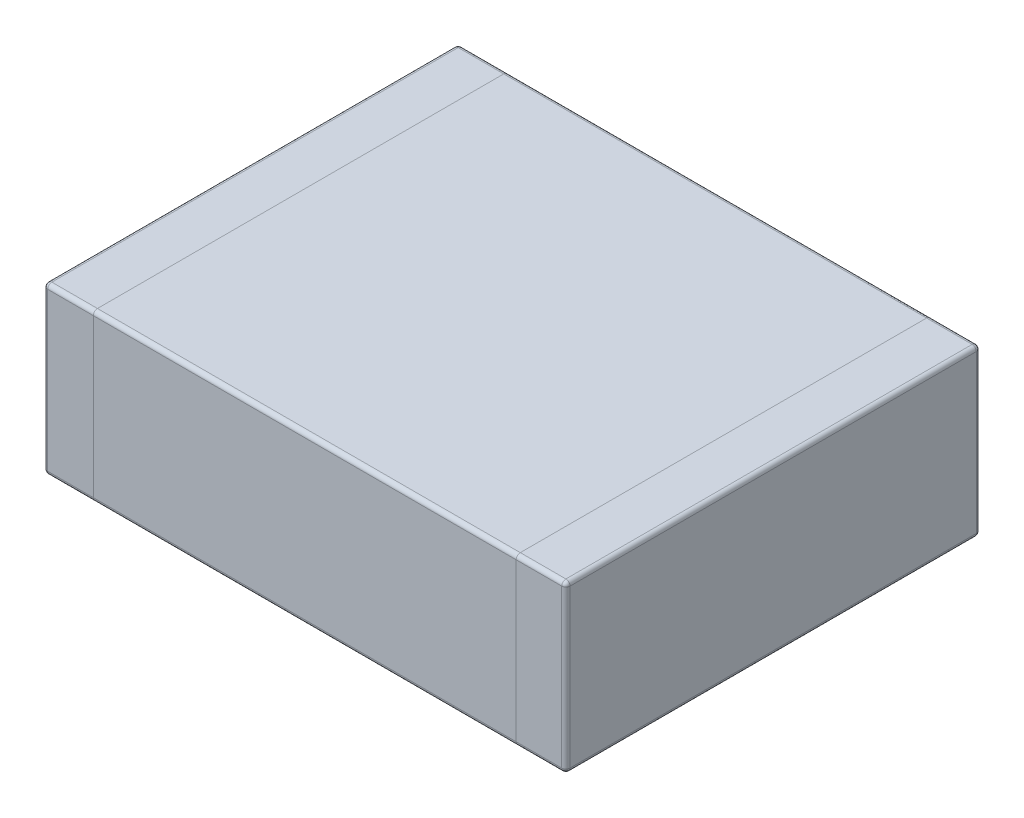
ISO-10303-21;
HEADER;
FILE_DESCRIPTION(('STEP AP214'),'2;1');
FILE_NAME('part.step','',(''),(''),'','','');
FILE_SCHEMA(('AUTOMOTIVE_DESIGN { 1 0 10303 214 1 1 1 1 }'));
ENDSEC;
DATA;
#1=APPLICATION_CONTEXT('core data for automotive mechanical design processes');
#2=APPLICATION_PROTOCOL_DEFINITION('international standard','automotive_design',2000,#1);
#3=PRODUCT_CONTEXT('',#1,'mechanical');
#4=PRODUCT('Part','Part','',(#3));
#5=PRODUCT_RELATED_PRODUCT_CATEGORY('part','',(#4));
#6=PRODUCT_DEFINITION_FORMATION('','',#4);
#7=PRODUCT_DEFINITION_CONTEXT('part definition',#1,'design');
#8=PRODUCT_DEFINITION('design','',#6,#7);
#9=PRODUCT_DEFINITION_SHAPE('','',#8);
#10=(LENGTH_UNIT() NAMED_UNIT(*) SI_UNIT(.MILLI.,.METRE.));
#11=(NAMED_UNIT(*) PLANE_ANGLE_UNIT() SI_UNIT($,.RADIAN.));
#12=(NAMED_UNIT(*) SI_UNIT($,.STERADIAN.) SOLID_ANGLE_UNIT());
#13=UNCERTAINTY_MEASURE_WITH_UNIT(LENGTH_MEASURE(1.E-05),#10,'distance_accuracy_value','');
#14=(GEOMETRIC_REPRESENTATION_CONTEXT(3) GLOBAL_UNCERTAINTY_ASSIGNED_CONTEXT((#13)) GLOBAL_UNIT_ASSIGNED_CONTEXT((#10,
#11,#12)) REPRESENTATION_CONTEXT('',''));
#15=CARTESIAN_POINT('',(0.,0.,0.));
#16=DIRECTION('',(0.,0.,1.));
#17=DIRECTION('',(1.,0.,0.));
#18=AXIS2_PLACEMENT_3D('',#15,#16,#17);
#19=CARTESIAN_POINT('',(3.15,2.,-2.5));
#20=DIRECTION('',(0.,-1.,0.));
#21=DIRECTION('',(0.,0.,-1.));
#22=AXIS2_PLACEMENT_3D('',#19,#20,#21);
#23=PLANE('',#22);
#24=DIRECTION('',(0.,0.,1.));
#25=VECTOR('',#24,1.);
#26=CARTESIAN_POINT('',(-2.55,2.,-2.5));
#27=LINE('',#26,#25);
#28=CARTESIAN_POINT('',(-2.55,2.,-2.45));
#29=VERTEX_POINT('',#28);
#30=CARTESIAN_POINT('',(-2.55,2.,2.45));
#31=VERTEX_POINT('',#30);
#32=EDGE_CURVE('E11',#29,#31,#27,.T.);
#33=ORIENTED_EDGE('',*,*,#32,.F.);
#34=DIRECTION('',(-1.,0.,0.));
#35=VECTOR('',#34,1.);
#36=CARTESIAN_POINT('',(3.15,2.,-2.45));
#37=LINE('',#36,#35);
#38=CARTESIAN_POINT('',(-3.1,2.,-2.45));
#39=VERTEX_POINT('',#38);
#40=EDGE_CURVE('E253',#29,#39,#37,.T.);
#41=ORIENTED_EDGE('',*,*,#40,.T.);
#42=DIRECTION('',(0.,0.,1.));
#43=VECTOR('',#42,1.);
#44=CARTESIAN_POINT('',(-3.1,2.,-2.5));
#45=LINE('',#44,#43);
#46=CARTESIAN_POINT('',(-3.1,2.,2.45));
#47=VERTEX_POINT('',#46);
#48=EDGE_CURVE('E256',#39,#47,#45,.T.);
#49=ORIENTED_EDGE('',*,*,#48,.T.);
#50=DIRECTION('',(1.,0.,0.));
#51=VECTOR('',#50,1.);
#52=CARTESIAN_POINT('',(3.15,2.,2.45));
#53=LINE('',#52,#51);
#54=EDGE_CURVE('E260',#47,#31,#53,.T.);
#55=ORIENTED_EDGE('',*,*,#54,.T.);
#56=EDGE_LOOP('',(#33,#41,#49,#55));
#57=FACE_BOUND('',#56,.T.);
#58=ADVANCED_FACE('F37',(#57),#23,.F.);
#59=DIRECTION('',(0.,0.,-1.));
#60=VECTOR('',#59,1.);
#61=CARTESIAN_POINT('',(2.55,2.,-2.5));
#62=LINE('',#61,#60);
#63=CARTESIAN_POINT('',(2.55,2.,2.45));
#64=VERTEX_POINT('',#63);
#65=CARTESIAN_POINT('',(2.55,2.,-2.45));
#66=VERTEX_POINT('',#65);
#67=EDGE_CURVE('E47',#64,#66,#62,.T.);
#68=ORIENTED_EDGE('',*,*,#67,.F.);
#69=CARTESIAN_POINT('',(3.1,2.,2.45));
#70=VERTEX_POINT('',#69);
#71=EDGE_CURVE('E259',#64,#70,#53,.T.);
#72=ORIENTED_EDGE('',*,*,#71,.T.);
#73=DIRECTION('',(0.,0.,-1.));
#74=VECTOR('',#73,1.);
#75=CARTESIAN_POINT('',(3.1,2.,-2.5));
#76=LINE('',#75,#74);
#77=CARTESIAN_POINT('',(3.1,2.,-2.45));
#78=VERTEX_POINT('',#77);
#79=EDGE_CURVE('E250',#70,#78,#76,.T.);
#80=ORIENTED_EDGE('',*,*,#79,.T.);
#81=EDGE_CURVE('E254',#78,#66,#37,.T.);
#82=ORIENTED_EDGE('',*,*,#81,.T.);
#83=EDGE_LOOP('',(#68,#72,#80,#82));
#84=FACE_BOUND('',#83,.T.);
#85=ADVANCED_FACE('F526',(#84),#23,.F.);
#86=CARTESIAN_POINT('',(3.15,1.95,2.45));
#87=DIRECTION('',(1.,0.,0.));
#88=DIRECTION('',(0.,0.,-1.));
#89=AXIS2_PLACEMENT_3D('',#86,#87,#88);
#90=CYLINDRICAL_SURFACE('',#89,0.05);
#91=DIRECTION('',(1.,0.,0.));
#92=VECTOR('',#91,1.);
#93=CARTESIAN_POINT('',(-3.15,1.95,2.5));
#94=LINE('',#93,#92);
#95=CARTESIAN_POINT('',(-2.55,1.95,2.5));
#96=VERTEX_POINT('',#95);
#97=CARTESIAN_POINT('',(-3.1,1.95,2.5));
#98=VERTEX_POINT('',#97);
#99=EDGE_CURVE('E246',#96,#98,#94,.F.);
#100=ORIENTED_EDGE('',*,*,#99,.F.);
#101=CARTESIAN_POINT('',(-2.55,1.95,2.45));
#102=DIRECTION('',(1.,0.,0.));
#103=DIRECTION('',(0.,0.,-1.));
#104=AXIS2_PLACEMENT_3D('',#101,#102,#103);
#105=CIRCLE('',#104,0.05);
#106=EDGE_CURVE('E354',#96,#31,#105,.F.);
#107=ORIENTED_EDGE('',*,*,#106,.T.);
#108=ORIENTED_EDGE('',*,*,#54,.F.);
#109=CARTESIAN_POINT('',(-3.1,1.95,2.45));
#110=DIRECTION('',(-1.,0.,0.));
#111=DIRECTION('',(0.,-1.,0.));
#112=AXIS2_PLACEMENT_3D('',#109,#110,#111);
#113=CIRCLE('',#112,0.05);
#114=EDGE_CURVE('E330',#47,#98,#113,.F.);
#115=ORIENTED_EDGE('',*,*,#114,.T.);
#116=EDGE_LOOP('',(#100,#107,#108,#115));
#117=FACE_BOUND('',#116,.T.);
#118=ADVANCED_FACE('F483',(#117),#90,.T.);
#119=ORIENTED_EDGE('',*,*,#71,.F.);
#120=CARTESIAN_POINT('',(2.55,1.95,2.45));
#121=DIRECTION('',(-1.,0.,0.));
#122=DIRECTION('',(0.,0.,1.));
#123=AXIS2_PLACEMENT_3D('',#120,#121,#122);
#124=CIRCLE('',#123,0.05);
#125=CARTESIAN_POINT('',(2.55,1.95,2.5));
#126=VERTEX_POINT('',#125);
#127=EDGE_CURVE('E353',#64,#126,#124,.F.);
#128=ORIENTED_EDGE('',*,*,#127,.T.);
#129=CARTESIAN_POINT('',(3.1,1.95,2.5));
#130=VERTEX_POINT('',#129);
#131=EDGE_CURVE('E247',#130,#126,#94,.F.);
#132=ORIENTED_EDGE('',*,*,#131,.F.);
#133=CARTESIAN_POINT('',(3.1,1.95,2.45));
#134=DIRECTION('',(1.,0.,0.));
#135=DIRECTION('',(0.,0.,-1.));
#136=AXIS2_PLACEMENT_3D('',#133,#134,#135);
#137=CIRCLE('',#136,0.05);
#138=EDGE_CURVE('E315',#70,#130,#137,.T.);
#139=ORIENTED_EDGE('',*,*,#138,.F.);
#140=EDGE_LOOP('',(#119,#128,#132,#139));
#141=FACE_BOUND('',#140,.T.);
#142=ADVANCED_FACE('F457',(#141),#90,.T.);
#143=CARTESIAN_POINT('',(-3.15,2.,2.5));
#144=DIRECTION('',(0.,0.,-1.));
#145=DIRECTION('',(-1.,0.,0.));
#146=AXIS2_PLACEMENT_3D('',#143,#144,#145);
#147=PLANE('',#146);
#148=DIRECTION('',(0.,-1.,0.));
#149=VECTOR('',#148,1.);
#150=CARTESIAN_POINT('',(-2.55,2.,2.5));
#151=LINE('',#150,#149);
#152=CARTESIAN_POINT('',(-2.55,0.0499999999999999,2.5));
#153=VERTEX_POINT('',#152);
#154=EDGE_CURVE('E349',#96,#153,#151,.T.);
#155=ORIENTED_EDGE('',*,*,#154,.F.);
#156=ORIENTED_EDGE('',*,*,#99,.T.);
#157=DIRECTION('',(0.,-1.,0.));
#158=VECTOR('',#157,1.);
#159=CARTESIAN_POINT('',(-3.1,2.,2.5));
#160=LINE('',#159,#158);
#161=CARTESIAN_POINT('',(-3.1,0.0499999999999999,2.5));
#162=VERTEX_POINT('',#161);
#163=EDGE_CURVE('E243',#98,#162,#160,.T.);
#164=ORIENTED_EDGE('',*,*,#163,.T.);
#165=DIRECTION('',(1.,0.,0.));
#166=VECTOR('',#165,1.);
#167=CARTESIAN_POINT('',(3.15,0.0499999999999999,2.5));
#168=LINE('',#167,#166);
#169=EDGE_CURVE('E237',#162,#153,#168,.T.);
#170=ORIENTED_EDGE('',*,*,#169,.T.);
#171=EDGE_LOOP('',(#155,#156,#164,#170));
#172=FACE_BOUND('',#171,.T.);
#173=ADVANCED_FACE('F471',(#172),#147,.F.);
#174=DIRECTION('',(0.,1.,0.));
#175=VECTOR('',#174,1.);
#176=CARTESIAN_POINT('',(2.55,2.,2.5));
#177=LINE('',#176,#175);
#178=CARTESIAN_POINT('',(2.55,0.0499999999999999,2.5));
#179=VERTEX_POINT('',#178);
#180=EDGE_CURVE('E345',#179,#126,#177,.T.);
#181=ORIENTED_EDGE('',*,*,#180,.F.);
#182=CARTESIAN_POINT('',(3.1,0.0499999999999999,2.5));
#183=VERTEX_POINT('',#182);
#184=EDGE_CURVE('E236',#179,#183,#168,.T.);
#185=ORIENTED_EDGE('',*,*,#184,.T.);
#186=DIRECTION('',(0.,-1.,0.));
#187=VECTOR('',#186,1.);
#188=CARTESIAN_POINT('',(3.1,2.,2.5));
#189=LINE('',#188,#187);
#190=EDGE_CURVE('E240',#183,#130,#189,.F.);
#191=ORIENTED_EDGE('',*,*,#190,.T.);
#192=ORIENTED_EDGE('',*,*,#131,.T.);
#193=EDGE_LOOP('',(#181,#185,#191,#192));
#194=FACE_BOUND('',#193,.T.);
#195=ADVANCED_FACE('F453',(#194),#147,.F.);
#196=CARTESIAN_POINT('',(-3.15,0.0499999999999999,2.45));
#197=DIRECTION('',(-1.,0.,0.));
#198=DIRECTION('',(0.,0.,1.));
#199=AXIS2_PLACEMENT_3D('',#196,#197,#198);
#200=CYLINDRICAL_SURFACE('',#199,0.05);
#201=DIRECTION('',(1.,0.,0.));
#202=VECTOR('',#201,1.);
#203=CARTESIAN_POINT('',(-3.15,0.,2.45));
#204=LINE('',#203,#202);
#205=CARTESIAN_POINT('',(-2.55,0.,2.45));
#206=VERTEX_POINT('',#205);
#207=CARTESIAN_POINT('',(-3.1,0.,2.45));
#208=VERTEX_POINT('',#207);
#209=EDGE_CURVE('E266',#206,#208,#204,.F.);
#210=ORIENTED_EDGE('',*,*,#209,.F.);
#211=CARTESIAN_POINT('',(-2.55,0.0499999999999999,2.45));
#212=DIRECTION('',(1.,0.,0.));
#213=DIRECTION('',(0.,0.,-1.));
#214=AXIS2_PLACEMENT_3D('',#211,#212,#213);
#215=CIRCLE('',#214,0.05);
#216=EDGE_CURVE('E350',#206,#153,#215,.F.);
#217=ORIENTED_EDGE('',*,*,#216,.T.);
#218=ORIENTED_EDGE('',*,*,#169,.F.);
#219=CARTESIAN_POINT('',(-3.1,0.05,2.45));
#220=DIRECTION('',(-1.,0.,0.));
#221=DIRECTION('',(0.,0.,1.));
#222=AXIS2_PLACEMENT_3D('',#219,#220,#221);
#223=CIRCLE('',#222,0.05);
#224=EDGE_CURVE('E321',#162,#208,#223,.F.);
#225=ORIENTED_EDGE('',*,*,#224,.T.);
#226=EDGE_LOOP('',(#210,#217,#218,#225));
#227=FACE_BOUND('',#226,.T.);
#228=ADVANCED_FACE('F509',(#227),#200,.T.);
#229=ORIENTED_EDGE('',*,*,#184,.F.);
#230=CARTESIAN_POINT('',(2.55,0.0499999999999999,2.45));
#231=DIRECTION('',(-1.,0.,0.));
#232=DIRECTION('',(0.,0.,1.));
#233=AXIS2_PLACEMENT_3D('',#230,#231,#232);
#234=CIRCLE('',#233,0.05);
#235=CARTESIAN_POINT('',(2.55,0.,2.45));
#236=VERTEX_POINT('',#235);
#237=EDGE_CURVE('E365',#179,#236,#234,.F.);
#238=ORIENTED_EDGE('',*,*,#237,.T.);
#239=CARTESIAN_POINT('',(3.1,0.,2.45));
#240=VERTEX_POINT('',#239);
#241=EDGE_CURVE('E267',#240,#236,#204,.F.);
#242=ORIENTED_EDGE('',*,*,#241,.F.);
#243=CARTESIAN_POINT('',(3.1,0.0499999999999999,2.45));
#244=DIRECTION('',(1.,0.,0.));
#245=DIRECTION('',(0.,0.,-1.));
#246=AXIS2_PLACEMENT_3D('',#243,#244,#245);
#247=CIRCLE('',#246,0.05);
#248=EDGE_CURVE('E301',#183,#240,#247,.T.);
#249=ORIENTED_EDGE('',*,*,#248,.F.);
#250=EDGE_LOOP('',(#229,#238,#242,#249));
#251=FACE_BOUND('',#250,.T.);
#252=ADVANCED_FACE('F443',(#251),#200,.T.);
#253=CARTESIAN_POINT('',(3.15,0.,-2.5));
#254=DIRECTION('',(0.,-1.,0.));
#255=DIRECTION('',(0.,0.,-1.));
#256=AXIS2_PLACEMENT_3D('',#253,#254,#255);
#257=PLANE('',#256);
#258=DIRECTION('',(-1.,0.,0.));
#259=VECTOR('',#258,1.);
#260=CARTESIAN_POINT('',(3.15,0.,-2.45));
#261=LINE('',#260,#259);
#262=CARTESIAN_POINT('',(-3.1,0.,-2.45));
#263=VERTEX_POINT('',#262);
#264=CARTESIAN_POINT('',(-2.55,0.,-2.45));
#265=VERTEX_POINT('',#264);
#266=EDGE_CURVE('E274',#263,#265,#261,.F.);
#267=ORIENTED_EDGE('',*,*,#266,.T.);
#268=DIRECTION('',(0.,0.,1.));
#269=VECTOR('',#268,1.);
#270=CARTESIAN_POINT('',(-2.55,0.,-2.5));
#271=LINE('',#270,#269);
#272=EDGE_CURVE('E366',#265,#206,#271,.T.);
#273=ORIENTED_EDGE('',*,*,#272,.T.);
#274=ORIENTED_EDGE('',*,*,#209,.T.);
#275=DIRECTION('',(0.,0.,1.));
#276=VECTOR('',#275,1.);
#277=CARTESIAN_POINT('',(-3.1,0.,-2.5));
#278=LINE('',#277,#276);
#279=EDGE_CURVE('E270',#208,#263,#278,.F.);
#280=ORIENTED_EDGE('',*,*,#279,.T.);
#281=EDGE_LOOP('',(#267,#273,#274,#280));
#282=FACE_BOUND('',#281,.T.);
#283=ADVANCED_FACE('F512',(#282),#257,.T.);
#284=ORIENTED_EDGE('',*,*,#241,.T.);
#285=DIRECTION('',(0.,0.,-1.));
#286=VECTOR('',#285,1.);
#287=CARTESIAN_POINT('',(2.55,0.,-2.5));
#288=LINE('',#287,#286);
#289=CARTESIAN_POINT('',(2.55,0.,-2.45));
#290=VERTEX_POINT('',#289);
#291=EDGE_CURVE('E360',#236,#290,#288,.T.);
#292=ORIENTED_EDGE('',*,*,#291,.T.);
#293=CARTESIAN_POINT('',(3.1,0.,-2.45));
#294=VERTEX_POINT('',#293);
#295=EDGE_CURVE('E273',#290,#294,#261,.F.);
#296=ORIENTED_EDGE('',*,*,#295,.T.);
#297=DIRECTION('',(0.,0.,-1.));
#298=VECTOR('',#297,1.);
#299=CARTESIAN_POINT('',(3.1,0.,2.5));
#300=LINE('',#299,#298);
#301=EDGE_CURVE('E263',#294,#240,#300,.F.);
#302=ORIENTED_EDGE('',*,*,#301,.T.);
#303=EDGE_LOOP('',(#284,#292,#296,#302));
#304=FACE_BOUND('',#303,.T.);
#305=ADVANCED_FACE('F387',(#304),#257,.T.);
#306=CARTESIAN_POINT('',(3.15,1.95,-2.45));
#307=DIRECTION('',(-1.,0.,0.));
#308=DIRECTION('',(0.,0.,1.));
#309=AXIS2_PLACEMENT_3D('',#306,#307,#308);
#310=CYLINDRICAL_SURFACE('',#309,0.05);
#311=ORIENTED_EDGE('',*,*,#40,.F.);
#312=CARTESIAN_POINT('',(-2.55,1.95,-2.45));
#313=DIRECTION('',(1.,0.,0.));
#314=DIRECTION('',(0.,0.,-1.));
#315=AXIS2_PLACEMENT_3D('',#312,#313,#314);
#316=CIRCLE('',#315,0.05);
#317=CARTESIAN_POINT('',(-2.55,1.95,-2.5));
#318=VERTEX_POINT('',#317);
#319=EDGE_CURVE('E357',#29,#318,#316,.F.);
#320=ORIENTED_EDGE('',*,*,#319,.T.);
#321=DIRECTION('',(-1.,0.,0.));
#322=VECTOR('',#321,1.);
#323=CARTESIAN_POINT('',(-3.15,1.95,-2.5));
#324=LINE('',#323,#322);
#325=CARTESIAN_POINT('',(-3.1,1.95,-2.5));
#326=VERTEX_POINT('',#325);
#327=EDGE_CURVE('E216',#326,#318,#324,.F.);
#328=ORIENTED_EDGE('',*,*,#327,.F.);
#329=CARTESIAN_POINT('',(-3.1,1.95,-2.45));
#330=DIRECTION('',(-1.,0.,0.));
#331=DIRECTION('',(0.,0.,1.));
#332=AXIS2_PLACEMENT_3D('',#329,#330,#331);
#333=CIRCLE('',#332,0.05);
#334=EDGE_CURVE('E292',#326,#39,#333,.F.);
#335=ORIENTED_EDGE('',*,*,#334,.T.);
#336=EDGE_LOOP('',(#311,#320,#328,#335));
#337=FACE_BOUND('',#336,.T.);
#338=ADVANCED_FACE('F519',(#337),#310,.T.);
#339=CARTESIAN_POINT('',(2.55,1.95,-2.5));
#340=VERTEX_POINT('',#339);
#341=CARTESIAN_POINT('',(3.1,1.95,-2.5));
#342=VERTEX_POINT('',#341);
#343=EDGE_CURVE('E211',#340,#342,#324,.F.);
#344=ORIENTED_EDGE('',*,*,#343,.F.);
#345=CARTESIAN_POINT('',(2.55,1.95,-2.45));
#346=DIRECTION('',(-1.,0.,0.));
#347=DIRECTION('',(0.,0.,1.));
#348=AXIS2_PLACEMENT_3D('',#345,#346,#347);
#349=CIRCLE('',#348,0.05);
#350=EDGE_CURVE('E361',#340,#66,#349,.F.);
#351=ORIENTED_EDGE('',*,*,#350,.T.);
#352=ORIENTED_EDGE('',*,*,#81,.F.);
#353=CARTESIAN_POINT('',(3.1,1.95,-2.45));
#354=DIRECTION('',(1.,0.,0.));
#355=DIRECTION('',(0.,1.,0.));
#356=AXIS2_PLACEMENT_3D('',#353,#354,#355);
#357=CIRCLE('',#356,0.05);
#358=EDGE_CURVE('E196',#342,#78,#357,.T.);
#359=ORIENTED_EDGE('',*,*,#358,.F.);
#360=EDGE_LOOP('',(#344,#351,#352,#359));
#361=FACE_BOUND('',#360,.T.);
#362=ADVANCED_FACE('F422',(#361),#310,.T.);
#363=CARTESIAN_POINT('',(-3.15,0.0499999999999999,-2.45));
#364=DIRECTION('',(1.,0.,0.));
#365=DIRECTION('',(0.,0.,-1.));
#366=AXIS2_PLACEMENT_3D('',#363,#364,#365);
#367=CYLINDRICAL_SURFACE('',#366,0.05);
#368=DIRECTION('',(-1.,0.,0.));
#369=VECTOR('',#368,1.);
#370=CARTESIAN_POINT('',(-3.15,0.0499999999999999,-2.5));
#371=LINE('',#370,#369);
#372=CARTESIAN_POINT('',(-2.55,0.0499999999999999,-2.5));
#373=VERTEX_POINT('',#372);
#374=CARTESIAN_POINT('',(-3.1,0.0499999999999999,-2.5));
#375=VERTEX_POINT('',#374);
#376=EDGE_CURVE('E208',#373,#375,#371,.T.);
#377=ORIENTED_EDGE('',*,*,#376,.F.);
#378=CARTESIAN_POINT('',(-2.55,0.0499999999999999,-2.45));
#379=DIRECTION('',(1.,0.,0.));
#380=DIRECTION('',(0.,0.,-1.));
#381=AXIS2_PLACEMENT_3D('',#378,#379,#380);
#382=CIRCLE('',#381,0.05);
#383=EDGE_CURVE('E370',#373,#265,#382,.F.);
#384=ORIENTED_EDGE('',*,*,#383,.T.);
#385=ORIENTED_EDGE('',*,*,#266,.F.);
#386=CARTESIAN_POINT('',(-3.1,0.0499999999999999,-2.45));
#387=DIRECTION('',(-1.,0.,0.));
#388=DIRECTION('',(0.,0.,1.));
#389=AXIS2_PLACEMENT_3D('',#386,#387,#388);
#390=CIRCLE('',#389,0.05);
#391=EDGE_CURVE('E289',#263,#375,#390,.F.);
#392=ORIENTED_EDGE('',*,*,#391,.T.);
#393=EDGE_LOOP('',(#377,#384,#385,#392));
#394=FACE_BOUND('',#393,.T.);
#395=ADVANCED_FACE('F405',(#394),#367,.T.);
#396=ORIENTED_EDGE('',*,*,#295,.F.);
#397=CARTESIAN_POINT('',(2.55,0.0499999999999999,-2.45));
#398=DIRECTION('',(-1.,0.,0.));
#399=DIRECTION('',(0.,0.,1.));
#400=AXIS2_PLACEMENT_3D('',#397,#398,#399);
#401=CIRCLE('',#400,0.05);
#402=CARTESIAN_POINT('',(2.55,0.0499999999999999,-2.5));
#403=VERTEX_POINT('',#402);
#404=EDGE_CURVE('E41',#290,#403,#401,.F.);
#405=ORIENTED_EDGE('',*,*,#404,.T.);
#406=CARTESIAN_POINT('',(3.1,0.0499999999999999,-2.5));
#407=VERTEX_POINT('',#406);
#408=EDGE_CURVE('E199',#407,#403,#371,.T.);
#409=ORIENTED_EDGE('',*,*,#408,.F.);
#410=CARTESIAN_POINT('',(3.1,0.05,-2.45));
#411=DIRECTION('',(1.,0.,0.));
#412=DIRECTION('',(0.,0.,-1.));
#413=AXIS2_PLACEMENT_3D('',#410,#411,#412);
#414=CIRCLE('',#413,0.05);
#415=EDGE_CURVE('E188',#294,#407,#414,.T.);
#416=ORIENTED_EDGE('',*,*,#415,.F.);
#417=EDGE_LOOP('',(#396,#405,#409,#416));
#418=FACE_BOUND('',#417,.T.);
#419=ADVANCED_FACE('F200',(#418),#367,.T.);
#420=CARTESIAN_POINT('',(-3.15,2.,-2.5));
#421=DIRECTION('',(0.,0.,1.));
#422=DIRECTION('',(1.,0.,0.));
#423=AXIS2_PLACEMENT_3D('',#420,#421,#422);
#424=PLANE('',#423);
#425=DIRECTION('',(0.,1.,0.));
#426=VECTOR('',#425,1.);
#427=CARTESIAN_POINT('',(-2.55,2.,-2.5));
#428=LINE('',#427,#426);
#429=EDGE_CURVE('E341',#373,#318,#428,.T.);
#430=ORIENTED_EDGE('',*,*,#429,.F.);
#431=ORIENTED_EDGE('',*,*,#376,.T.);
#432=DIRECTION('',(0.,-1.,0.));
#433=VECTOR('',#432,1.);
#434=CARTESIAN_POINT('',(-3.1,2.,-2.5));
#435=LINE('',#434,#433);
#436=EDGE_CURVE('E205',#375,#326,#435,.F.);
#437=ORIENTED_EDGE('',*,*,#436,.T.);
#438=ORIENTED_EDGE('',*,*,#327,.T.);
#439=EDGE_LOOP('',(#430,#431,#437,#438));
#440=FACE_BOUND('',#439,.T.);
#441=ADVANCED_FACE('F408',(#440),#424,.F.);
#442=DIRECTION('',(0.,-1.,0.));
#443=VECTOR('',#442,1.);
#444=CARTESIAN_POINT('',(2.55,2.,-2.5));
#445=LINE('',#444,#443);
#446=EDGE_CURVE('E276',#340,#403,#445,.T.);
#447=ORIENTED_EDGE('',*,*,#446,.F.);
#448=ORIENTED_EDGE('',*,*,#343,.T.);
#449=DIRECTION('',(0.,-1.,0.));
#450=VECTOR('',#449,1.);
#451=CARTESIAN_POINT('',(3.1,2.,-2.5));
#452=LINE('',#451,#450);
#453=EDGE_CURVE('E180',#342,#407,#452,.T.);
#454=ORIENTED_EDGE('',*,*,#453,.T.);
#455=ORIENTED_EDGE('',*,*,#408,.T.);
#456=EDGE_LOOP('',(#447,#448,#454,#455));
#457=FACE_BOUND('',#456,.T.);
#458=ADVANCED_FACE('F209',(#457),#424,.F.);
#459=CARTESIAN_POINT('',(3.15,2.,2.5));
#460=DIRECTION('',(-1.,0.,0.));
#461=DIRECTION('',(0.,0.,1.));
#462=AXIS2_PLACEMENT_3D('',#459,#460,#461);
#463=PLANE('',#462);
#464=DIRECTION('',(0.,-1.,0.));
#465=VECTOR('',#464,1.);
#466=CARTESIAN_POINT('',(3.15,2.,-2.45));
#467=LINE('',#466,#465);
#468=CARTESIAN_POINT('',(3.15,0.0499999999999999,-2.45));
#469=VERTEX_POINT('',#468);
#470=CARTESIAN_POINT('',(3.15,1.95,-2.45));
#471=VERTEX_POINT('',#470);
#472=EDGE_CURVE('E182',#469,#471,#467,.F.);
#473=ORIENTED_EDGE('',*,*,#472,.T.);
#474=DIRECTION('',(0.,0.,-1.));
#475=VECTOR('',#474,1.);
#476=CARTESIAN_POINT('',(3.15,1.95,2.5));
#477=LINE('',#476,#475);
#478=CARTESIAN_POINT('',(3.15,1.95,2.45));
#479=VERTEX_POINT('',#478);
#480=EDGE_CURVE('E225',#471,#479,#477,.F.);
#481=ORIENTED_EDGE('',*,*,#480,.T.);
#482=DIRECTION('',(0.,-1.,0.));
#483=VECTOR('',#482,1.);
#484=CARTESIAN_POINT('',(3.15,2.,2.45));
#485=LINE('',#484,#483);
#486=CARTESIAN_POINT('',(3.15,0.0499999999999999,2.45));
#487=VERTEX_POINT('',#486);
#488=EDGE_CURVE('E222',#479,#487,#485,.T.);
#489=ORIENTED_EDGE('',*,*,#488,.T.);
#490=DIRECTION('',(0.,0.,-1.));
#491=VECTOR('',#490,1.);
#492=CARTESIAN_POINT('',(3.15,0.0499999999999999,-2.5));
#493=LINE('',#492,#491);
#494=EDGE_CURVE('E220',#487,#469,#493,.T.);
#495=ORIENTED_EDGE('',*,*,#494,.T.);
#496=EDGE_LOOP('',(#473,#481,#489,#495));
#497=FACE_BOUND('',#496,.T.);
#498=ADVANCED_FACE('F434',(#497),#463,.F.);
#499=EDGE_CURVE('E206',#403,#373,#371,.T.);
#500=ORIENTED_EDGE('',*,*,#499,.T.);
#501=ORIENTED_EDGE('',*,*,#429,.T.);
#502=EDGE_CURVE('E214',#318,#340,#324,.F.);
#503=ORIENTED_EDGE('',*,*,#502,.T.);
#504=ORIENTED_EDGE('',*,*,#446,.T.);
#505=EDGE_LOOP('',(#500,#501,#503,#504));
#506=FACE_BOUND('',#505,.T.);
#507=ADVANCED_FACE('F414',(#506),#424,.F.);
#508=CARTESIAN_POINT('',(-3.15,2.,2.5));
#509=DIRECTION('',(1.,0.,0.));
#510=DIRECTION('',(0.,0.,-1.));
#511=AXIS2_PLACEMENT_3D('',#508,#509,#510);
#512=PLANE('',#511);
#513=DIRECTION('',(0.,-1.,0.));
#514=VECTOR('',#513,1.);
#515=CARTESIAN_POINT('',(-3.15,2.,2.45));
#516=LINE('',#515,#514);
#517=CARTESIAN_POINT('',(-3.15,0.0499999999999999,2.45));
#518=VERTEX_POINT('',#517);
#519=CARTESIAN_POINT('',(-3.15,1.95,2.45));
#520=VERTEX_POINT('',#519);
#521=EDGE_CURVE('E229',#518,#520,#516,.F.);
#522=ORIENTED_EDGE('',*,*,#521,.T.);
#523=DIRECTION('',(0.,0.,1.));
#524=VECTOR('',#523,1.);
#525=CARTESIAN_POINT('',(-3.15,1.95,2.5));
#526=LINE('',#525,#524);
#527=CARTESIAN_POINT('',(-3.15,1.95,-2.45));
#528=VERTEX_POINT('',#527);
#529=EDGE_CURVE('E234',#520,#528,#526,.F.);
#530=ORIENTED_EDGE('',*,*,#529,.T.);
#531=DIRECTION('',(0.,-1.,0.));
#532=VECTOR('',#531,1.);
#533=CARTESIAN_POINT('',(-3.15,2.,-2.45));
#534=LINE('',#533,#532);
#535=CARTESIAN_POINT('',(-3.15,0.0499999999999999,-2.45));
#536=VERTEX_POINT('',#535);
#537=EDGE_CURVE('E231',#528,#536,#534,.T.);
#538=ORIENTED_EDGE('',*,*,#537,.T.);
#539=DIRECTION('',(0.,0.,1.));
#540=VECTOR('',#539,1.);
#541=CARTESIAN_POINT('',(-3.15,0.0499999999999999,2.5));
#542=LINE('',#541,#540);
#543=EDGE_CURVE('E227',#536,#518,#542,.T.);
#544=ORIENTED_EDGE('',*,*,#543,.T.);
#545=EDGE_LOOP('',(#522,#530,#538,#544));
#546=FACE_BOUND('',#545,.T.);
#547=ADVANCED_FACE('F491',(#546),#512,.F.);
#548=EDGE_CURVE('E251',#126,#96,#94,.F.);
#549=ORIENTED_EDGE('',*,*,#548,.T.);
#550=ORIENTED_EDGE('',*,*,#154,.T.);
#551=EDGE_CURVE('E241',#153,#179,#168,.T.);
#552=ORIENTED_EDGE('',*,*,#551,.T.);
#553=ORIENTED_EDGE('',*,*,#180,.T.);
#554=EDGE_LOOP('',(#549,#550,#552,#553));
#555=FACE_BOUND('',#554,.T.);
#556=ADVANCED_FACE('F464',(#555),#147,.F.);
#557=EDGE_CURVE('E257',#66,#29,#37,.T.);
#558=ORIENTED_EDGE('',*,*,#557,.T.);
#559=ORIENTED_EDGE('',*,*,#32,.T.);
#560=EDGE_CURVE('E264',#31,#64,#53,.T.);
#561=ORIENTED_EDGE('',*,*,#560,.T.);
#562=ORIENTED_EDGE('',*,*,#67,.T.);
#563=EDGE_LOOP('',(#558,#559,#561,#562));
#564=FACE_BOUND('',#563,.T.);
#565=ADVANCED_FACE('F524',(#564),#23,.F.);
#566=ORIENTED_EDGE('',*,*,#272,.F.);
#567=EDGE_CURVE('E277',#265,#290,#261,.F.);
#568=ORIENTED_EDGE('',*,*,#567,.T.);
#569=ORIENTED_EDGE('',*,*,#291,.F.);
#570=EDGE_CURVE('E271',#236,#206,#204,.F.);
#571=ORIENTED_EDGE('',*,*,#570,.T.);
#572=EDGE_LOOP('',(#566,#568,#569,#571));
#573=FACE_BOUND('',#572,.T.);
#574=ADVANCED_FACE('F399',(#573),#257,.T.);
#575=CARTESIAN_POINT('',(-3.1,2.,2.45));
#576=DIRECTION('',(0.,-1.,0.));
#577=DIRECTION('',(0.,0.,-1.));
#578=AXIS2_PLACEMENT_3D('',#575,#576,#577);
#579=CYLINDRICAL_SURFACE('',#578,0.05);
#580=CARTESIAN_POINT('',(-3.1,1.95,2.45));
#581=DIRECTION('',(0.,1.,0.));
#582=DIRECTION('',(0.,0.,1.));
#583=AXIS2_PLACEMENT_3D('',#580,#581,#582);
#584=CIRCLE('',#583,0.05);
#585=EDGE_CURVE('E336',#520,#98,#584,.T.);
#586=ORIENTED_EDGE('',*,*,#585,.F.);
#587=ORIENTED_EDGE('',*,*,#521,.F.);
#588=CARTESIAN_POINT('',(-3.1,0.0499999999999999,2.45));
#589=DIRECTION('',(0.,-1.,0.));
#590=DIRECTION('',(0.,0.,-1.));
#591=AXIS2_PLACEMENT_3D('',#588,#589,#590);
#592=CIRCLE('',#591,0.05);
#593=EDGE_CURVE('E333',#162,#518,#592,.T.);
#594=ORIENTED_EDGE('',*,*,#593,.F.);
#595=ORIENTED_EDGE('',*,*,#163,.F.);
#596=EDGE_LOOP('',(#586,#587,#594,#595));
#597=FACE_BOUND('',#596,.T.);
#598=ADVANCED_FACE('F39',(#597),#579,.T.);
#599=CARTESIAN_POINT('',(-3.1,1.95,2.45));
#600=DIRECTION('',(0.,0.,1.));
#601=DIRECTION('',(1.,0.,0.));
#602=AXIS2_PLACEMENT_3D('',#599,#600,#601);
#603=SPHERICAL_SURFACE('',#602,0.05);
#604=CARTESIAN_POINT('',(-3.1,1.95,2.45));
#605=DIRECTION('',(0.,0.,1.));
#606=DIRECTION('',(1.,0.,0.));
#607=AXIS2_PLACEMENT_3D('',#604,#605,#606);
#608=CIRCLE('',#607,0.05);
#609=EDGE_CURVE('E327',#520,#47,#608,.F.);
#610=ORIENTED_EDGE('',*,*,#609,.F.);
#611=ORIENTED_EDGE('',*,*,#585,.T.);
#612=ORIENTED_EDGE('',*,*,#114,.F.);
#613=EDGE_LOOP('',(#610,#611,#612));
#614=FACE_BOUND('',#613,.T.);
#615=ADVANCED_FACE('F480',(#614),#603,.T.);
#616=CARTESIAN_POINT('',(-3.1,0.05,2.45));
#617=DIRECTION('',(0.,0.,1.));
#618=DIRECTION('',(1.,0.,0.));
#619=AXIS2_PLACEMENT_3D('',#616,#617,#618);
#620=SPHERICAL_SURFACE('',#619,0.05);
#621=ORIENTED_EDGE('',*,*,#224,.F.);
#622=ORIENTED_EDGE('',*,*,#593,.T.);
#623=CARTESIAN_POINT('',(-3.1,0.0499999999999999,2.45));
#624=DIRECTION('',(0.,0.,1.));
#625=DIRECTION('',(1.,0.,0.));
#626=AXIS2_PLACEMENT_3D('',#623,#624,#625);
#627=CIRCLE('',#626,0.05);
#628=EDGE_CURVE('E324',#208,#518,#627,.F.);
#629=ORIENTED_EDGE('',*,*,#628,.F.);
#630=EDGE_LOOP('',(#621,#622,#629));
#631=FACE_BOUND('',#630,.T.);
#632=ADVANCED_FACE('F507',(#631),#620,.T.);
#633=ORIENTED_EDGE('',*,*,#106,.F.);
#634=ORIENTED_EDGE('',*,*,#548,.F.);
#635=ORIENTED_EDGE('',*,*,#127,.F.);
#636=ORIENTED_EDGE('',*,*,#560,.F.);
#637=EDGE_LOOP('',(#633,#634,#635,#636));
#638=FACE_BOUND('',#637,.T.);
#639=ADVANCED_FACE('F466',(#638),#90,.T.);
#640=CARTESIAN_POINT('',(-3.1,1.95,-2.5));
#641=DIRECTION('',(0.,0.,1.));
#642=DIRECTION('',(1.,0.,0.));
#643=AXIS2_PLACEMENT_3D('',#640,#641,#642);
#644=CYLINDRICAL_SURFACE('',#643,0.05);
#645=ORIENTED_EDGE('',*,*,#609,.T.);
#646=ORIENTED_EDGE('',*,*,#48,.F.);
#647=CARTESIAN_POINT('',(-3.1,1.95,-2.45));
#648=DIRECTION('',(0.,0.,-1.));
#649=DIRECTION('',(0.,1.,0.));
#650=AXIS2_PLACEMENT_3D('',#647,#648,#649);
#651=CIRCLE('',#650,0.05);
#652=EDGE_CURVE('E312',#528,#39,#651,.T.);
#653=ORIENTED_EDGE('',*,*,#652,.F.);
#654=ORIENTED_EDGE('',*,*,#529,.F.);
#655=EDGE_LOOP('',(#645,#646,#653,#654));
#656=FACE_BOUND('',#655,.T.);
#657=ADVANCED_FACE('F488',(#656),#644,.T.);
#658=CARTESIAN_POINT('',(-3.1,2.,-2.45));
#659=DIRECTION('',(0.,-1.,0.));
#660=DIRECTION('',(0.,0.,-1.));
#661=AXIS2_PLACEMENT_3D('',#658,#659,#660);
#662=CYLINDRICAL_SURFACE('',#661,0.05);
#663=CARTESIAN_POINT('',(-3.1,0.0499999999999999,-2.45));
#664=DIRECTION('',(0.,-1.,0.));
#665=DIRECTION('',(0.,0.,-1.));
#666=AXIS2_PLACEMENT_3D('',#663,#664,#665);
#667=CIRCLE('',#666,0.05);
#668=EDGE_CURVE('E306',#536,#375,#667,.T.);
#669=ORIENTED_EDGE('',*,*,#668,.F.);
#670=ORIENTED_EDGE('',*,*,#537,.F.);
#671=CARTESIAN_POINT('',(-3.1,1.95,-2.45));
#672=DIRECTION('',(0.,1.,0.));
#673=DIRECTION('',(0.,0.,1.));
#674=AXIS2_PLACEMENT_3D('',#671,#672,#673);
#675=CIRCLE('',#674,0.05);
#676=EDGE_CURVE('E309',#326,#528,#675,.T.);
#677=ORIENTED_EDGE('',*,*,#676,.F.);
#678=ORIENTED_EDGE('',*,*,#436,.F.);
#679=EDGE_LOOP('',(#669,#670,#677,#678));
#680=FACE_BOUND('',#679,.T.);
#681=ADVANCED_FACE('F495',(#680),#662,.T.);
#682=CARTESIAN_POINT('',(-3.1,0.0499999999999999,2.5));
#683=DIRECTION('',(0.,0.,-1.));
#684=DIRECTION('',(-1.,0.,0.));
#685=AXIS2_PLACEMENT_3D('',#682,#683,#684);
#686=CYLINDRICAL_SURFACE('',#685,0.05);
#687=ORIENTED_EDGE('',*,*,#628,.T.);
#688=ORIENTED_EDGE('',*,*,#543,.F.);
#689=CARTESIAN_POINT('',(-3.1,0.05,-2.45));
#690=DIRECTION('',(0.,0.,-1.));
#691=DIRECTION('',(-1.,0.,0.));
#692=AXIS2_PLACEMENT_3D('',#689,#690,#691);
#693=CIRCLE('',#692,0.05);
#694=EDGE_CURVE('E304',#263,#536,#693,.T.);
#695=ORIENTED_EDGE('',*,*,#694,.F.);
#696=ORIENTED_EDGE('',*,*,#279,.F.);
#697=EDGE_LOOP('',(#687,#688,#695,#696));
#698=FACE_BOUND('',#697,.T.);
#699=ADVANCED_FACE('F502',(#698),#686,.T.);
#700=ORIENTED_EDGE('',*,*,#216,.F.);
#701=ORIENTED_EDGE('',*,*,#570,.F.);
#702=ORIENTED_EDGE('',*,*,#237,.F.);
#703=ORIENTED_EDGE('',*,*,#551,.F.);
#704=EDGE_LOOP('',(#700,#701,#702,#703));
#705=FACE_BOUND('',#704,.T.);
#706=ADVANCED_FACE('F511',(#705),#200,.T.);
#707=CARTESIAN_POINT('',(3.1,2.,2.45));
#708=DIRECTION('',(0.,-1.,0.));
#709=DIRECTION('',(0.,0.,-1.));
#710=AXIS2_PLACEMENT_3D('',#707,#708,#709);
#711=CYLINDRICAL_SURFACE('',#710,0.05);
#712=CARTESIAN_POINT('',(3.1,1.95,2.45));
#713=DIRECTION('',(0.,1.,0.));
#714=DIRECTION('',(0.,0.,1.));
#715=AXIS2_PLACEMENT_3D('',#712,#713,#714);
#716=CIRCLE('',#715,0.05);
#717=EDGE_CURVE('E318',#130,#479,#716,.T.);
#718=ORIENTED_EDGE('',*,*,#717,.F.);
#719=ORIENTED_EDGE('',*,*,#190,.F.);
#720=CARTESIAN_POINT('',(3.1,0.0499999999999999,2.45));
#721=DIRECTION('',(0.,-1.,0.));
#722=DIRECTION('',(0.,0.,-1.));
#723=AXIS2_PLACEMENT_3D('',#720,#721,#722);
#724=CIRCLE('',#723,0.05);
#725=EDGE_CURVE('E298',#487,#183,#724,.T.);
#726=ORIENTED_EDGE('',*,*,#725,.F.);
#727=ORIENTED_EDGE('',*,*,#488,.F.);
#728=EDGE_LOOP('',(#718,#719,#726,#727));
#729=FACE_BOUND('',#728,.T.);
#730=ADVANCED_FACE('F450',(#729),#711,.T.);
#731=CARTESIAN_POINT('',(3.1,1.95,2.45));
#732=DIRECTION('',(0.,0.,1.));
#733=DIRECTION('',(1.,0.,0.));
#734=AXIS2_PLACEMENT_3D('',#731,#732,#733);
#735=SPHERICAL_SURFACE('',#734,0.05);
#736=ORIENTED_EDGE('',*,*,#138,.T.);
#737=ORIENTED_EDGE('',*,*,#717,.T.);
#738=CARTESIAN_POINT('',(3.1,1.95,2.45));
#739=DIRECTION('',(0.,0.,1.));
#740=DIRECTION('',(0.,-1.,0.));
#741=AXIS2_PLACEMENT_3D('',#738,#739,#740);
#742=CIRCLE('',#741,0.05);
#743=EDGE_CURVE('E295',#70,#479,#742,.F.);
#744=ORIENTED_EDGE('',*,*,#743,.F.);
#745=EDGE_LOOP('',(#736,#737,#744));
#746=FACE_BOUND('',#745,.T.);
#747=ADVANCED_FACE('F535',(#746),#735,.T.);
#748=CARTESIAN_POINT('',(-3.1,1.95,-2.45));
#749=DIRECTION('',(0.,0.,1.));
#750=DIRECTION('',(1.,0.,0.));
#751=AXIS2_PLACEMENT_3D('',#748,#749,#750);
#752=SPHERICAL_SURFACE('',#751,0.05);
#753=ORIENTED_EDGE('',*,*,#676,.T.);
#754=ORIENTED_EDGE('',*,*,#652,.T.);
#755=ORIENTED_EDGE('',*,*,#334,.F.);
#756=EDGE_LOOP('',(#753,#754,#755));
#757=FACE_BOUND('',#756,.T.);
#758=ADVANCED_FACE('F537',(#757),#752,.T.);
#759=CARTESIAN_POINT('',(-3.1,0.05,-2.45));
#760=DIRECTION('',(0.,0.,1.));
#761=DIRECTION('',(1.,0.,0.));
#762=AXIS2_PLACEMENT_3D('',#759,#760,#761);
#763=SPHERICAL_SURFACE('',#762,0.05);
#764=ORIENTED_EDGE('',*,*,#694,.T.);
#765=ORIENTED_EDGE('',*,*,#668,.T.);
#766=ORIENTED_EDGE('',*,*,#391,.F.);
#767=EDGE_LOOP('',(#764,#765,#766));
#768=FACE_BOUND('',#767,.T.);
#769=ADVANCED_FACE('F543',(#768),#763,.T.);
#770=CARTESIAN_POINT('',(3.1,0.05,2.45));
#771=DIRECTION('',(0.,0.,1.));
#772=DIRECTION('',(1.,0.,0.));
#773=AXIS2_PLACEMENT_3D('',#770,#771,#772);
#774=SPHERICAL_SURFACE('',#773,0.05);
#775=ORIENTED_EDGE('',*,*,#725,.T.);
#776=ORIENTED_EDGE('',*,*,#248,.T.);
#777=CARTESIAN_POINT('',(3.1,0.05,2.45));
#778=DIRECTION('',(0.,0.,1.));
#779=DIRECTION('',(1.,0.,0.));
#780=AXIS2_PLACEMENT_3D('',#777,#778,#779);
#781=CIRCLE('',#780,0.05);
#782=EDGE_CURVE('E286',#487,#240,#781,.F.);
#783=ORIENTED_EDGE('',*,*,#782,.F.);
#784=EDGE_LOOP('',(#775,#776,#783));
#785=FACE_BOUND('',#784,.T.);
#786=ADVANCED_FACE('F446',(#785),#774,.T.);
#787=CARTESIAN_POINT('',(3.1,1.95,-2.5));
#788=DIRECTION('',(0.,0.,-1.));
#789=DIRECTION('',(-1.,0.,0.));
#790=AXIS2_PLACEMENT_3D('',#787,#788,#789);
#791=CYLINDRICAL_SURFACE('',#790,0.05);
#792=ORIENTED_EDGE('',*,*,#743,.T.);
#793=ORIENTED_EDGE('',*,*,#480,.F.);
#794=CARTESIAN_POINT('',(3.1,1.95,-2.45));
#795=DIRECTION('',(0.,0.,-1.));
#796=DIRECTION('',(-1.,0.,0.));
#797=AXIS2_PLACEMENT_3D('',#794,#795,#796);
#798=CIRCLE('',#797,0.05);
#799=EDGE_CURVE('E283',#78,#471,#798,.T.);
#800=ORIENTED_EDGE('',*,*,#799,.F.);
#801=ORIENTED_EDGE('',*,*,#79,.F.);
#802=EDGE_LOOP('',(#792,#793,#800,#801));
#803=FACE_BOUND('',#802,.T.);
#804=ADVANCED_FACE('F430',(#803),#791,.T.);
#805=ORIENTED_EDGE('',*,*,#319,.F.);
#806=ORIENTED_EDGE('',*,*,#557,.F.);
#807=ORIENTED_EDGE('',*,*,#350,.F.);
#808=ORIENTED_EDGE('',*,*,#502,.F.);
#809=EDGE_LOOP('',(#805,#806,#807,#808));
#810=FACE_BOUND('',#809,.T.);
#811=ADVANCED_FACE('F417',(#810),#310,.T.);
#812=ORIENTED_EDGE('',*,*,#383,.F.);
#813=ORIENTED_EDGE('',*,*,#499,.F.);
#814=ORIENTED_EDGE('',*,*,#404,.F.);
#815=ORIENTED_EDGE('',*,*,#567,.F.);
#816=EDGE_LOOP('',(#812,#813,#814,#815));
#817=FACE_BOUND('',#816,.T.);
#818=ADVANCED_FACE('F396',(#817),#367,.T.);
#819=CARTESIAN_POINT('',(3.1,0.0499999999999999,2.5));
#820=DIRECTION('',(0.,0.,1.));
#821=DIRECTION('',(1.,0.,0.));
#822=AXIS2_PLACEMENT_3D('',#819,#820,#821);
#823=CYLINDRICAL_SURFACE('',#822,0.05);
#824=ORIENTED_EDGE('',*,*,#782,.T.);
#825=ORIENTED_EDGE('',*,*,#301,.F.);
#826=CARTESIAN_POINT('',(3.1,0.0499999999999999,-2.45));
#827=DIRECTION('',(0.,0.,-1.));
#828=DIRECTION('',(-1.,0.,0.));
#829=AXIS2_PLACEMENT_3D('',#826,#827,#828);
#830=CIRCLE('',#829,0.05);
#831=EDGE_CURVE('E192',#469,#294,#830,.T.);
#832=ORIENTED_EDGE('',*,*,#831,.F.);
#833=ORIENTED_EDGE('',*,*,#494,.F.);
#834=EDGE_LOOP('',(#824,#825,#832,#833));
#835=FACE_BOUND('',#834,.T.);
#836=ADVANCED_FACE('F438',(#835),#823,.T.);
#837=CARTESIAN_POINT('',(3.1,1.95,-2.45));
#838=DIRECTION('',(0.,0.,1.));
#839=DIRECTION('',(1.,0.,0.));
#840=AXIS2_PLACEMENT_3D('',#837,#838,#839);
#841=SPHERICAL_SURFACE('',#840,0.05);
#842=ORIENTED_EDGE('',*,*,#358,.T.);
#843=ORIENTED_EDGE('',*,*,#799,.T.);
#844=CARTESIAN_POINT('',(3.1,1.95,-2.45));
#845=DIRECTION('',(0.,1.,0.));
#846=DIRECTION('',(0.,0.,1.));
#847=AXIS2_PLACEMENT_3D('',#844,#845,#846);
#848=CIRCLE('',#847,0.05);
#849=EDGE_CURVE('E185',#342,#471,#848,.F.);
#850=ORIENTED_EDGE('',*,*,#849,.F.);
#851=EDGE_LOOP('',(#842,#843,#850));
#852=FACE_BOUND('',#851,.T.);
#853=ADVANCED_FACE('F426',(#852),#841,.T.);
#854=CARTESIAN_POINT('',(3.1,0.05,-2.45));
#855=DIRECTION('',(0.,0.,1.));
#856=DIRECTION('',(1.,0.,0.));
#857=AXIS2_PLACEMENT_3D('',#854,#855,#856);
#858=SPHERICAL_SURFACE('',#857,0.05);
#859=ORIENTED_EDGE('',*,*,#831,.T.);
#860=ORIENTED_EDGE('',*,*,#415,.T.);
#861=CARTESIAN_POINT('',(3.1,0.0499999999999999,-2.45));
#862=DIRECTION('',(0.,-1.,0.));
#863=DIRECTION('',(0.,0.,-1.));
#864=AXIS2_PLACEMENT_3D('',#861,#862,#863);
#865=CIRCLE('',#864,0.05);
#866=EDGE_CURVE('E176',#469,#407,#865,.F.);
#867=ORIENTED_EDGE('',*,*,#866,.F.);
#868=EDGE_LOOP('',(#859,#860,#867));
#869=FACE_BOUND('',#868,.T.);
#870=ADVANCED_FACE('F190',(#869),#858,.T.);
#871=CARTESIAN_POINT('',(3.1,2.,-2.45));
#872=DIRECTION('',(0.,-1.,0.));
#873=DIRECTION('',(0.,0.,-1.));
#874=AXIS2_PLACEMENT_3D('',#871,#872,#873);
#875=CYLINDRICAL_SURFACE('',#874,0.05);
#876=ORIENTED_EDGE('',*,*,#849,.T.);
#877=ORIENTED_EDGE('',*,*,#472,.F.);
#878=ORIENTED_EDGE('',*,*,#866,.T.);
#879=ORIENTED_EDGE('',*,*,#453,.F.);
#880=EDGE_LOOP('',(#876,#877,#878,#879));
#881=FACE_BOUND('',#880,.T.);
#882=ADVANCED_FACE('F178',(#881),#875,.T.);
#883=CLOSED_SHELL('',(#58,#85,#118,#142,#173,#195,#228,#252,#283,#305,#338,#362,#395,#419,#441,
#458,#498,#507,#547,#556,#565,#574,#598,#615,#632,#639,#657,#681,#699,#706,#730,#747,#758,#769,
#786,#804,#811,#818,#836,#853,#870,#882));
#884=MANIFOLD_SOLID_BREP('B2',#883);
#885=ADVANCED_BREP_SHAPE_REPRESENTATION('',(#18,#884),#14);
#886=SHAPE_DEFINITION_REPRESENTATION(#9,#885);
ENDSEC;
END-ISO-10303-21;
